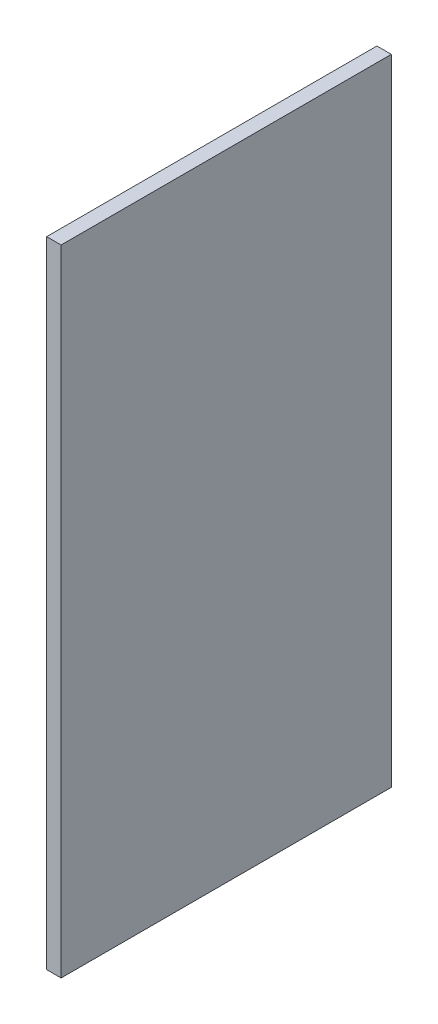
ISO-10303-21;
HEADER;
FILE_DESCRIPTION(('STEP AP214'),'2;1');
FILE_NAME('part.step','',(''),(''),'','','');
FILE_SCHEMA(('AUTOMOTIVE_DESIGN { 1 0 10303 214 1 1 1 1 }'));
ENDSEC;
DATA;
#1=APPLICATION_CONTEXT('core data for automotive mechanical design processes');
#2=APPLICATION_PROTOCOL_DEFINITION('international standard','automotive_design',2000,#1);
#3=PRODUCT_CONTEXT('',#1,'mechanical');
#4=PRODUCT('Part','Part','',(#3));
#5=PRODUCT_RELATED_PRODUCT_CATEGORY('part','',(#4));
#6=PRODUCT_DEFINITION_FORMATION('','',#4);
#7=PRODUCT_DEFINITION_CONTEXT('part definition',#1,'design');
#8=PRODUCT_DEFINITION('design','',#6,#7);
#9=PRODUCT_DEFINITION_SHAPE('','',#8);
#10=(LENGTH_UNIT() NAMED_UNIT(*) SI_UNIT(.MILLI.,.METRE.));
#11=(NAMED_UNIT(*) PLANE_ANGLE_UNIT() SI_UNIT($,.RADIAN.));
#12=(NAMED_UNIT(*) SI_UNIT($,.STERADIAN.) SOLID_ANGLE_UNIT());
#13=UNCERTAINTY_MEASURE_WITH_UNIT(LENGTH_MEASURE(1.E-05),#10,'distance_accuracy_value','');
#14=(GEOMETRIC_REPRESENTATION_CONTEXT(3) GLOBAL_UNCERTAINTY_ASSIGNED_CONTEXT((#13)) GLOBAL_UNIT_ASSIGNED_CONTEXT((#10,
#11,#12)) REPRESENTATION_CONTEXT('',''));
#15=CARTESIAN_POINT('',(0.,0.,0.));
#16=DIRECTION('',(0.,0.,1.));
#17=DIRECTION('',(1.,0.,0.));
#18=AXIS2_PLACEMENT_3D('',#15,#16,#17);
#19=CARTESIAN_POINT('',(18.,0.,0.));
#20=DIRECTION('',(0.,0.,1.));
#21=DIRECTION('',(1.,0.,0.));
#22=AXIS2_PLACEMENT_3D('',#19,#20,#21);
#23=PLANE('',#22);
#24=DIRECTION('',(0.,1.,0.));
#25=VECTOR('',#24,1.);
#26=CARTESIAN_POINT('',(0.,0.,0.));
#27=LINE('',#26,#25);
#28=CARTESIAN_POINT('',(0.,0.,0.));
#29=VERTEX_POINT('',#28);
#30=CARTESIAN_POINT('',(0.,792.,0.));
#31=VERTEX_POINT('',#30);
#32=EDGE_CURVE('E99',#29,#31,#27,.T.);
#33=ORIENTED_EDGE('',*,*,#32,.F.);
#34=DIRECTION('',(-1.,0.,0.));
#35=VECTOR('',#34,1.);
#36=CARTESIAN_POINT('',(18.,0.,0.));
#37=LINE('',#36,#35);
#38=CARTESIAN_POINT('',(18.,0.,0.));
#39=VERTEX_POINT('',#38);
#40=EDGE_CURVE('E11',#39,#29,#37,.T.);
#41=ORIENTED_EDGE('',*,*,#40,.F.);
#42=DIRECTION('',(0.,1.,0.));
#43=VECTOR('',#42,1.);
#44=CARTESIAN_POINT('',(18.,0.,0.));
#45=LINE('',#44,#43);
#46=CARTESIAN_POINT('',(18.,792.,0.));
#47=VERTEX_POINT('',#46);
#48=EDGE_CURVE('E94',#39,#47,#45,.T.);
#49=ORIENTED_EDGE('',*,*,#48,.T.);
#50=DIRECTION('',(-1.,0.,0.));
#51=VECTOR('',#50,1.);
#52=CARTESIAN_POINT('',(18.,792.,0.));
#53=LINE('',#52,#51);
#54=EDGE_CURVE('E37',#47,#31,#53,.T.);
#55=ORIENTED_EDGE('',*,*,#54,.T.);
#56=EDGE_LOOP('',(#33,#41,#49,#55));
#57=FACE_BOUND('',#56,.T.);
#58=ADVANCED_FACE('F34',(#57),#23,.T.);
#59=CARTESIAN_POINT('',(18.,0.,0.));
#60=DIRECTION('',(0.,1.,0.));
#61=DIRECTION('',(0.,0.,1.));
#62=AXIS2_PLACEMENT_3D('',#59,#60,#61);
#63=PLANE('',#62);
#64=DIRECTION('',(0.,0.,-1.));
#65=VECTOR('',#64,1.);
#66=CARTESIAN_POINT('',(0.,0.,0.));
#67=LINE('',#66,#65);
#68=CARTESIAN_POINT('',(0.,0.,-412.));
#69=VERTEX_POINT('',#68);
#70=EDGE_CURVE('E67',#29,#69,#67,.T.);
#71=ORIENTED_EDGE('',*,*,#70,.T.);
#72=DIRECTION('',(-1.,0.,0.));
#73=VECTOR('',#72,1.);
#74=CARTESIAN_POINT('',(18.,0.,-412.));
#75=LINE('',#74,#73);
#76=CARTESIAN_POINT('',(18.,0.,-412.));
#77=VERTEX_POINT('',#76);
#78=EDGE_CURVE('E43',#77,#69,#75,.T.);
#79=ORIENTED_EDGE('',*,*,#78,.F.);
#80=DIRECTION('',(0.,0.,-1.));
#81=VECTOR('',#80,1.);
#82=CARTESIAN_POINT('',(18.,0.,0.));
#83=LINE('',#82,#81);
#84=EDGE_CURVE('E84',#39,#77,#83,.T.);
#85=ORIENTED_EDGE('',*,*,#84,.F.);
#86=ORIENTED_EDGE('',*,*,#40,.T.);
#87=EDGE_LOOP('',(#71,#79,#85,#86));
#88=FACE_BOUND('',#87,.T.);
#89=ADVANCED_FACE('F109',(#88),#63,.F.);
#90=CARTESIAN_POINT('',(18.,0.,-412.));
#91=DIRECTION('',(0.,0.,1.));
#92=DIRECTION('',(1.,0.,0.));
#93=AXIS2_PLACEMENT_3D('',#90,#91,#92);
#94=PLANE('',#93);
#95=DIRECTION('',(0.,1.,0.));
#96=VECTOR('',#95,1.);
#97=CARTESIAN_POINT('',(0.,0.,-412.));
#98=LINE('',#97,#96);
#99=CARTESIAN_POINT('',(0.,792.,-412.));
#100=VERTEX_POINT('',#99);
#101=EDGE_CURVE('E91',#69,#100,#98,.T.);
#102=ORIENTED_EDGE('',*,*,#101,.T.);
#103=DIRECTION('',(-1.,0.,0.));
#104=VECTOR('',#103,1.);
#105=CARTESIAN_POINT('',(18.,792.,-412.));
#106=LINE('',#105,#104);
#107=CARTESIAN_POINT('',(18.,792.,-412.));
#108=VERTEX_POINT('',#107);
#109=EDGE_CURVE('E88',#108,#100,#106,.T.);
#110=ORIENTED_EDGE('',*,*,#109,.F.);
#111=DIRECTION('',(0.,1.,0.));
#112=VECTOR('',#111,1.);
#113=CARTESIAN_POINT('',(18.,0.,-412.));
#114=LINE('',#113,#112);
#115=EDGE_CURVE('E79',#77,#108,#114,.T.);
#116=ORIENTED_EDGE('',*,*,#115,.F.);
#117=ORIENTED_EDGE('',*,*,#78,.T.);
#118=EDGE_LOOP('',(#102,#110,#116,#117));
#119=FACE_BOUND('',#118,.T.);
#120=ADVANCED_FACE('F89',(#119),#94,.F.);
#121=CARTESIAN_POINT('',(18.,792.,0.));
#122=DIRECTION('',(0.,1.,0.));
#123=DIRECTION('',(0.,0.,1.));
#124=AXIS2_PLACEMENT_3D('',#121,#122,#123);
#125=PLANE('',#124);
#126=DIRECTION('',(0.,0.,-1.));
#127=VECTOR('',#126,1.);
#128=CARTESIAN_POINT('',(0.,792.,0.));
#129=LINE('',#128,#127);
#130=EDGE_CURVE('E102',#31,#100,#129,.T.);
#131=ORIENTED_EDGE('',*,*,#130,.F.);
#132=ORIENTED_EDGE('',*,*,#54,.F.);
#133=DIRECTION('',(0.,0.,-1.));
#134=VECTOR('',#133,1.);
#135=CARTESIAN_POINT('',(18.,792.,0.));
#136=LINE('',#135,#134);
#137=EDGE_CURVE('E83',#47,#108,#136,.T.);
#138=ORIENTED_EDGE('',*,*,#137,.T.);
#139=ORIENTED_EDGE('',*,*,#109,.T.);
#140=EDGE_LOOP('',(#131,#132,#138,#139));
#141=FACE_BOUND('',#140,.T.);
#142=ADVANCED_FACE('F93',(#141),#125,.T.);
#143=CARTESIAN_POINT('',(18.,0.,0.));
#144=DIRECTION('',(-1.,0.,0.));
#145=DIRECTION('',(0.,0.,1.));
#146=AXIS2_PLACEMENT_3D('',#143,#144,#145);
#147=PLANE('',#146);
#148=ORIENTED_EDGE('',*,*,#48,.F.);
#149=ORIENTED_EDGE('',*,*,#84,.T.);
#150=ORIENTED_EDGE('',*,*,#115,.T.);
#151=ORIENTED_EDGE('',*,*,#137,.F.);
#152=EDGE_LOOP('',(#148,#149,#150,#151));
#153=FACE_BOUND('',#152,.T.);
#154=ADVANCED_FACE('F82',(#153),#147,.F.);
#155=CARTESIAN_POINT('',(0.,0.,0.));
#156=DIRECTION('',(-1.,0.,0.));
#157=DIRECTION('',(0.,0.,1.));
#158=AXIS2_PLACEMENT_3D('',#155,#156,#157);
#159=PLANE('',#158);
#160=ORIENTED_EDGE('',*,*,#32,.T.);
#161=ORIENTED_EDGE('',*,*,#130,.T.);
#162=ORIENTED_EDGE('',*,*,#101,.F.);
#163=ORIENTED_EDGE('',*,*,#70,.F.);
#164=EDGE_LOOP('',(#160,#161,#162,#163));
#165=FACE_BOUND('',#164,.T.);
#166=ADVANCED_FACE('F107',(#165),#159,.T.);
#167=CLOSED_SHELL('',(#58,#89,#120,#142,#154,#166));
#168=MANIFOLD_SOLID_BREP('B2',#167);
#169=ADVANCED_BREP_SHAPE_REPRESENTATION('',(#18,#168),#14);
#170=SHAPE_DEFINITION_REPRESENTATION(#9,#169);
ENDSEC;
END-ISO-10303-21;
